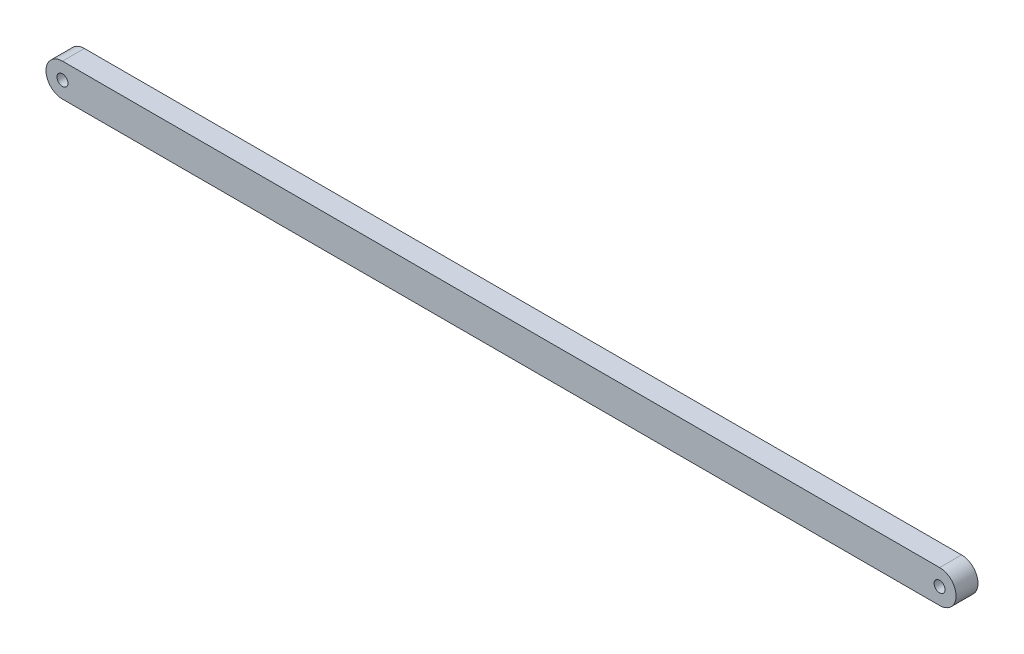
ISO-10303-21;
HEADER;
FILE_DESCRIPTION(('STEP AP214'),'2;1');
FILE_NAME('part.step','',(''),(''),'','','');
FILE_SCHEMA(('AUTOMOTIVE_DESIGN { 1 0 10303 214 1 1 1 1 }'));
ENDSEC;
DATA;
#1=APPLICATION_CONTEXT('core data for automotive mechanical design processes');
#2=APPLICATION_PROTOCOL_DEFINITION('international standard','automotive_design',2000,#1);
#3=PRODUCT_CONTEXT('',#1,'mechanical');
#4=PRODUCT('Part','Part','',(#3));
#5=PRODUCT_RELATED_PRODUCT_CATEGORY('part','',(#4));
#6=PRODUCT_DEFINITION_FORMATION('','',#4);
#7=PRODUCT_DEFINITION_CONTEXT('part definition',#1,'design');
#8=PRODUCT_DEFINITION('design','',#6,#7);
#9=PRODUCT_DEFINITION_SHAPE('','',#8);
#10=(LENGTH_UNIT() NAMED_UNIT(*) SI_UNIT(.MILLI.,.METRE.));
#11=(NAMED_UNIT(*) PLANE_ANGLE_UNIT() SI_UNIT($,.RADIAN.));
#12=(NAMED_UNIT(*) SI_UNIT($,.STERADIAN.) SOLID_ANGLE_UNIT());
#13=UNCERTAINTY_MEASURE_WITH_UNIT(LENGTH_MEASURE(1.E-05),#10,'distance_accuracy_value','');
#14=(GEOMETRIC_REPRESENTATION_CONTEXT(3) GLOBAL_UNCERTAINTY_ASSIGNED_CONTEXT((#13)) GLOBAL_UNIT_ASSIGNED_CONTEXT((#10,
#11,#12)) REPRESENTATION_CONTEXT('',''));
#15=CARTESIAN_POINT('',(0.,0.,0.));
#16=DIRECTION('',(0.,0.,1.));
#17=DIRECTION('',(1.,0.,0.));
#18=AXIS2_PLACEMENT_3D('',#15,#16,#17);
#19=CARTESIAN_POINT('',(-50.5402090511013,29.5782696919985,2.));
#20=DIRECTION('',(0.,0.,1.));
#21=DIRECTION('',(1.,0.,0.));
#22=AXIS2_PLACEMENT_3D('',#19,#20,#21);
#23=PLANE('',#22);
#24=CARTESIAN_POINT('',(-50.5402090511013,29.5782696919985,2.));
#25=DIRECTION('',(0.,0.,1.));
#26=DIRECTION('',(1.,0.,0.));
#27=AXIS2_PLACEMENT_3D('',#24,#25,#26);
#28=CIRCLE('',#27,0.499999999999999);
#29=CARTESIAN_POINT('',(-50.0402090511013,29.5782696919985,2.));
#30=VERTEX_POINT('',#29);
#31=EDGE_CURVE('E106',#30,#30,#28,.T.);
#32=ORIENTED_EDGE('',*,*,#31,.F.);
#33=EDGE_LOOP('',(#32));
#34=FACE_BOUND('',#33,.T.);
#35=CARTESIAN_POINT('',(-50.5402090511013,29.5782696919985,2.));
#36=DIRECTION('',(0.,0.,1.));
#37=DIRECTION('',(1.,0.,0.));
#38=AXIS2_PLACEMENT_3D('',#35,#36,#37);
#39=CIRCLE('',#38,1.5);
#40=CARTESIAN_POINT('',(-50.5402090511013,31.0782696919985,2.));
#41=VERTEX_POINT('',#40);
#42=CARTESIAN_POINT('',(-50.5402090511013,28.0782696919985,2.));
#43=VERTEX_POINT('',#42);
#44=EDGE_CURVE('E91',#41,#43,#39,.T.);
#45=ORIENTED_EDGE('',*,*,#44,.T.);
#46=DIRECTION('',(1.,0.,0.));
#47=VECTOR('',#46,1.);
#48=CARTESIAN_POINT('',(-50.5402090511013,28.0782696919985,2.));
#49=LINE('',#48,#47);
#50=CARTESIAN_POINT('',(29.4597909488987,28.0782696919985,2.));
#51=VERTEX_POINT('',#50);
#52=EDGE_CURVE('E86',#43,#51,#49,.T.);
#53=ORIENTED_EDGE('',*,*,#52,.T.);
#54=CARTESIAN_POINT('',(29.4597909488987,29.5782696919985,2.));
#55=DIRECTION('',(0.,0.,1.));
#56=DIRECTION('',(1.,0.,0.));
#57=AXIS2_PLACEMENT_3D('',#54,#55,#56);
#58=CIRCLE('',#57,1.5);
#59=CARTESIAN_POINT('',(29.4597909488987,31.0782696919985,2.));
#60=VERTEX_POINT('',#59);
#61=EDGE_CURVE('E89',#51,#60,#58,.T.);
#62=ORIENTED_EDGE('',*,*,#61,.T.);
#63=DIRECTION('',(-1.,0.,0.));
#64=VECTOR('',#63,1.);
#65=CARTESIAN_POINT('',(-50.5402090511013,31.0782696919985,2.));
#66=LINE('',#65,#64);
#67=EDGE_CURVE('E56',#60,#41,#66,.T.);
#68=ORIENTED_EDGE('',*,*,#67,.T.);
#69=EDGE_LOOP('',(#45,#53,#62,#68));
#70=FACE_BOUND('',#69,.T.);
#71=CARTESIAN_POINT('',(29.4597909488987,29.5782696919985,2.));
#72=DIRECTION('',(0.,0.,1.));
#73=DIRECTION('',(1.,0.,0.));
#74=AXIS2_PLACEMENT_3D('',#71,#72,#73);
#75=CIRCLE('',#74,0.499999999999999);
#76=CARTESIAN_POINT('',(29.9597909488987,29.5782696919985,2.));
#77=VERTEX_POINT('',#76);
#78=EDGE_CURVE('E121',#77,#77,#75,.T.);
#79=ORIENTED_EDGE('',*,*,#78,.F.);
#80=EDGE_LOOP('',(#79));
#81=FACE_BOUND('',#80,.T.);
#82=ADVANCED_FACE('F39',(#34,#70,#81),#23,.T.);
#83=CARTESIAN_POINT('',(-50.5402090511013,29.5782696919985,0.));
#84=DIRECTION('',(0.,0.,1.));
#85=DIRECTION('',(1.,0.,0.));
#86=AXIS2_PLACEMENT_3D('',#83,#84,#85);
#87=PLANE('',#86);
#88=CARTESIAN_POINT('',(-50.5402090511013,29.5782696919985,0.));
#89=DIRECTION('',(0.,0.,1.));
#90=DIRECTION('',(1.,0.,0.));
#91=AXIS2_PLACEMENT_3D('',#88,#89,#90);
#92=CIRCLE('',#91,1.5);
#93=CARTESIAN_POINT('',(-50.5402090511013,31.0782696919985,0.));
#94=VERTEX_POINT('',#93);
#95=CARTESIAN_POINT('',(-50.5402090511013,28.0782696919985,0.));
#96=VERTEX_POINT('',#95);
#97=EDGE_CURVE('E103',#94,#96,#92,.T.);
#98=ORIENTED_EDGE('',*,*,#97,.F.);
#99=DIRECTION('',(-1.,0.,0.));
#100=VECTOR('',#99,1.);
#101=CARTESIAN_POINT('',(-50.5402090511013,31.0782696919985,0.));
#102=LINE('',#101,#100);
#103=CARTESIAN_POINT('',(29.4597909488987,31.0782696919985,0.));
#104=VERTEX_POINT('',#103);
#105=EDGE_CURVE('E79',#104,#94,#102,.T.);
#106=ORIENTED_EDGE('',*,*,#105,.F.);
#107=CARTESIAN_POINT('',(29.4597909488987,29.5782696919985,0.));
#108=DIRECTION('',(0.,0.,1.));
#109=DIRECTION('',(1.,0.,0.));
#110=AXIS2_PLACEMENT_3D('',#107,#108,#109);
#111=CIRCLE('',#110,1.5);
#112=CARTESIAN_POINT('',(29.4597909488987,28.0782696919985,0.));
#113=VERTEX_POINT('',#112);
#114=EDGE_CURVE('E73',#113,#104,#111,.T.);
#115=ORIENTED_EDGE('',*,*,#114,.F.);
#116=DIRECTION('',(1.,0.,0.));
#117=VECTOR('',#116,1.);
#118=CARTESIAN_POINT('',(-50.5402090511013,28.0782696919985,0.));
#119=LINE('',#118,#117);
#120=EDGE_CURVE('E95',#96,#113,#119,.T.);
#121=ORIENTED_EDGE('',*,*,#120,.F.);
#122=EDGE_LOOP('',(#98,#106,#115,#121));
#123=FACE_BOUND('',#122,.T.);
#124=CARTESIAN_POINT('',(-50.5402090511013,29.5782696919985,0.));
#125=DIRECTION('',(0.,0.,1.));
#126=DIRECTION('',(1.,0.,0.));
#127=AXIS2_PLACEMENT_3D('',#124,#125,#126);
#128=CIRCLE('',#127,0.499999999999999);
#129=CARTESIAN_POINT('',(-50.0402090511013,29.5782696919985,0.));
#130=VERTEX_POINT('',#129);
#131=EDGE_CURVE('E118',#130,#130,#128,.T.);
#132=ORIENTED_EDGE('',*,*,#131,.T.);
#133=EDGE_LOOP('',(#132));
#134=FACE_BOUND('',#133,.T.);
#135=CARTESIAN_POINT('',(29.4597909488987,29.5782696919985,0.));
#136=DIRECTION('',(0.,0.,1.));
#137=DIRECTION('',(1.,0.,0.));
#138=AXIS2_PLACEMENT_3D('',#135,#136,#137);
#139=CIRCLE('',#138,0.499999999999999);
#140=CARTESIAN_POINT('',(29.9597909488987,29.5782696919985,0.));
#141=VERTEX_POINT('',#140);
#142=EDGE_CURVE('E124',#141,#141,#139,.T.);
#143=ORIENTED_EDGE('',*,*,#142,.T.);
#144=EDGE_LOOP('',(#143));
#145=FACE_BOUND('',#144,.T.);
#146=ADVANCED_FACE('F114',(#123,#134,#145),#87,.F.);
#147=CARTESIAN_POINT('',(-50.5402090511013,29.5782696919985,2.));
#148=DIRECTION('',(0.,0.,-1.));
#149=DIRECTION('',(-1.,0.,0.));
#150=AXIS2_PLACEMENT_3D('',#147,#148,#149);
#151=CYLINDRICAL_SURFACE('',#150,1.5);
#152=ORIENTED_EDGE('',*,*,#97,.T.);
#153=DIRECTION('',(0.,0.,-1.));
#154=VECTOR('',#153,1.);
#155=CARTESIAN_POINT('',(-50.5402090511013,28.0782696919985,2.));
#156=LINE('',#155,#154);
#157=EDGE_CURVE('E11',#43,#96,#156,.T.);
#158=ORIENTED_EDGE('',*,*,#157,.F.);
#159=ORIENTED_EDGE('',*,*,#44,.F.);
#160=DIRECTION('',(0.,0.,-1.));
#161=VECTOR('',#160,1.);
#162=CARTESIAN_POINT('',(-50.5402090511013,31.0782696919985,2.));
#163=LINE('',#162,#161);
#164=EDGE_CURVE('E99',#41,#94,#163,.T.);
#165=ORIENTED_EDGE('',*,*,#164,.T.);
#166=EDGE_LOOP('',(#152,#158,#159,#165));
#167=FACE_BOUND('',#166,.T.);
#168=ADVANCED_FACE('F41',(#167),#151,.T.);
#169=CARTESIAN_POINT('',(-50.5402090511013,28.0782696919985,2.));
#170=DIRECTION('',(0.,1.,0.));
#171=DIRECTION('',(0.,0.,1.));
#172=AXIS2_PLACEMENT_3D('',#169,#170,#171);
#173=PLANE('',#172);
#174=ORIENTED_EDGE('',*,*,#120,.T.);
#175=DIRECTION('',(0.,0.,-1.));
#176=VECTOR('',#175,1.);
#177=CARTESIAN_POINT('',(29.4597909488987,28.0782696919985,2.));
#178=LINE('',#177,#176);
#179=EDGE_CURVE('E48',#51,#113,#178,.T.);
#180=ORIENTED_EDGE('',*,*,#179,.F.);
#181=ORIENTED_EDGE('',*,*,#52,.F.);
#182=ORIENTED_EDGE('',*,*,#157,.T.);
#183=EDGE_LOOP('',(#174,#180,#181,#182));
#184=FACE_BOUND('',#183,.T.);
#185=ADVANCED_FACE('F94',(#184),#173,.F.);
#186=CARTESIAN_POINT('',(29.4597909488987,29.5782696919985,2.));
#187=DIRECTION('',(0.,0.,-1.));
#188=DIRECTION('',(-1.,0.,0.));
#189=AXIS2_PLACEMENT_3D('',#186,#187,#188);
#190=CYLINDRICAL_SURFACE('',#189,1.5);
#191=ORIENTED_EDGE('',*,*,#114,.T.);
#192=DIRECTION('',(0.,0.,-1.));
#193=VECTOR('',#192,1.);
#194=CARTESIAN_POINT('',(29.4597909488987,31.0782696919985,2.));
#195=LINE('',#194,#193);
#196=EDGE_CURVE('E96',#60,#104,#195,.T.);
#197=ORIENTED_EDGE('',*,*,#196,.F.);
#198=ORIENTED_EDGE('',*,*,#61,.F.);
#199=ORIENTED_EDGE('',*,*,#179,.T.);
#200=EDGE_LOOP('',(#191,#197,#198,#199));
#201=FACE_BOUND('',#200,.T.);
#202=ADVANCED_FACE('F97',(#201),#190,.T.);
#203=CARTESIAN_POINT('',(-50.5402090511013,31.0782696919985,2.));
#204=DIRECTION('',(0.,-1.,0.));
#205=DIRECTION('',(1.,0.,0.));
#206=AXIS2_PLACEMENT_3D('',#203,#204,#205);
#207=PLANE('',#206);
#208=ORIENTED_EDGE('',*,*,#105,.T.);
#209=ORIENTED_EDGE('',*,*,#164,.F.);
#210=ORIENTED_EDGE('',*,*,#67,.F.);
#211=ORIENTED_EDGE('',*,*,#196,.T.);
#212=EDGE_LOOP('',(#208,#209,#210,#211));
#213=FACE_BOUND('',#212,.T.);
#214=ADVANCED_FACE('F111',(#213),#207,.F.);
#215=CARTESIAN_POINT('',(-50.5402090511013,29.5782696919985,2.));
#216=DIRECTION('',(0.,0.,-1.));
#217=DIRECTION('',(-1.,0.,0.));
#218=AXIS2_PLACEMENT_3D('',#215,#216,#217);
#219=CYLINDRICAL_SURFACE('',#218,0.499999999999999);
#220=ORIENTED_EDGE('',*,*,#31,.T.);
#221=EDGE_LOOP('',(#220));
#222=FACE_BOUND('',#221,.T.);
#223=ORIENTED_EDGE('',*,*,#131,.F.);
#224=EDGE_LOOP('',(#223));
#225=FACE_BOUND('',#224,.T.);
#226=ADVANCED_FACE('F142',(#222,#225),#219,.F.);
#227=CARTESIAN_POINT('',(29.4597909488987,29.5782696919985,2.));
#228=DIRECTION('',(0.,0.,-1.));
#229=DIRECTION('',(-1.,0.,0.));
#230=AXIS2_PLACEMENT_3D('',#227,#228,#229);
#231=CYLINDRICAL_SURFACE('',#230,0.499999999999999);
#232=ORIENTED_EDGE('',*,*,#78,.T.);
#233=EDGE_LOOP('',(#232));
#234=FACE_BOUND('',#233,.T.);
#235=ORIENTED_EDGE('',*,*,#142,.F.);
#236=EDGE_LOOP('',(#235));
#237=FACE_BOUND('',#236,.T.);
#238=ADVANCED_FACE('F130',(#234,#237),#231,.F.);
#239=CLOSED_SHELL('',(#82,#146,#168,#185,#202,#214,#226,#238));
#240=MANIFOLD_SOLID_BREP('B2',#239);
#241=ADVANCED_BREP_SHAPE_REPRESENTATION('',(#18,#240),#14);
#242=SHAPE_DEFINITION_REPRESENTATION(#9,#241);
ENDSEC;
END-ISO-10303-21;
